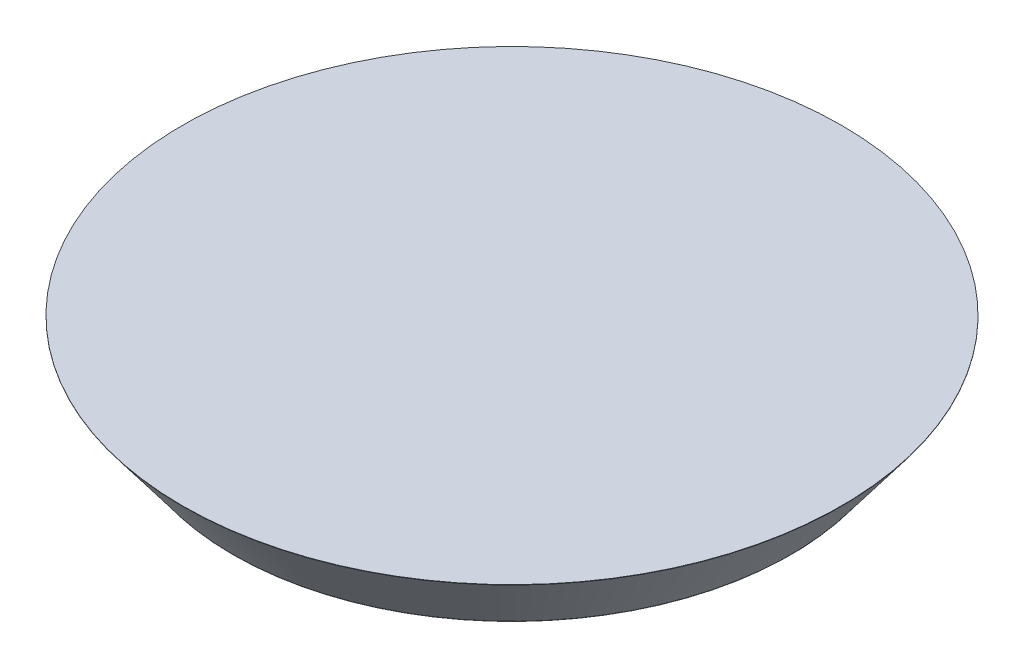
ISO-10303-21;
HEADER;
FILE_DESCRIPTION(('STEP AP214'),'2;1');
FILE_NAME('part.step','',(''),(''),'','','');
FILE_SCHEMA(('AUTOMOTIVE_DESIGN { 1 0 10303 214 1 1 1 1 }'));
ENDSEC;
DATA;
#1=APPLICATION_CONTEXT('core data for automotive mechanical design processes');
#2=APPLICATION_PROTOCOL_DEFINITION('international standard','automotive_design',2000,#1);
#3=PRODUCT_CONTEXT('',#1,'mechanical');
#4=PRODUCT('Part','Part','',(#3));
#5=PRODUCT_RELATED_PRODUCT_CATEGORY('part','',(#4));
#6=PRODUCT_DEFINITION_FORMATION('','',#4);
#7=PRODUCT_DEFINITION_CONTEXT('part definition',#1,'design');
#8=PRODUCT_DEFINITION('design','',#6,#7);
#9=PRODUCT_DEFINITION_SHAPE('','',#8);
#10=(LENGTH_UNIT() NAMED_UNIT(*) SI_UNIT(.MILLI.,.METRE.));
#11=(NAMED_UNIT(*) PLANE_ANGLE_UNIT() SI_UNIT($,.RADIAN.));
#12=(NAMED_UNIT(*) SI_UNIT($,.STERADIAN.) SOLID_ANGLE_UNIT());
#13=UNCERTAINTY_MEASURE_WITH_UNIT(LENGTH_MEASURE(1.E-05),#10,'distance_accuracy_value','');
#14=(GEOMETRIC_REPRESENTATION_CONTEXT(3) GLOBAL_UNCERTAINTY_ASSIGNED_CONTEXT((#13)) GLOBAL_UNIT_ASSIGNED_CONTEXT((#10,
#11,#12)) REPRESENTATION_CONTEXT('',''));
#15=CARTESIAN_POINT('',(0.,0.,0.));
#16=DIRECTION('',(0.,0.,1.));
#17=DIRECTION('',(1.,0.,0.));
#18=AXIS2_PLACEMENT_3D('',#15,#16,#17);
#19=CARTESIAN_POINT('',(0.,6.5024,0.));
#20=DIRECTION('',(0.,-1.,0.));
#21=DIRECTION('',(0.,0.,-1.));
#22=AXIS2_PLACEMENT_3D('',#19,#20,#21);
#23=CYLINDRICAL_SURFACE('',#22,48.8061);
#24=CARTESIAN_POINT('',(0.,3.45125892994247,0.));
#25=DIRECTION('',(0.,1.,0.));
#26=DIRECTION('',(0.,0.,1.));
#27=AXIS2_PLACEMENT_3D('',#24,#25,#26);
#28=CIRCLE('',#27,48.8061);
#29=CARTESIAN_POINT('',(0.,3.45125892994247,48.8061));
#30=VERTEX_POINT('',#29);
#31=EDGE_CURVE('E45',#30,#30,#28,.T.);
#32=ORIENTED_EDGE('',*,*,#31,.T.);
#33=EDGE_LOOP('',(#32));
#34=FACE_BOUND('',#33,.T.);
#35=CARTESIAN_POINT('',(0.,3.50519999999999,0.));
#36=DIRECTION('',(0.,-1.,0.));
#37=DIRECTION('',(0.,0.,-1.));
#38=AXIS2_PLACEMENT_3D('',#35,#36,#37);
#39=CIRCLE('',#38,48.8061);
#40=CARTESIAN_POINT('',(0.,3.5052,-48.8061));
#41=VERTEX_POINT('',#40);
#42=EDGE_CURVE('E11',#41,#41,#39,.T.);
#43=ORIENTED_EDGE('',*,*,#42,.T.);
#44=EDGE_LOOP('',(#43));
#45=FACE_BOUND('',#44,.T.);
#46=ADVANCED_FACE('F34',(#34,#45),#23,.T.);
#47=CARTESIAN_POINT('',(0.,3.45125892994247,0.));
#48=DIRECTION('',(0.,1.,0.));
#49=DIRECTION('',(0.,0.,1.));
#50=AXIS2_PLACEMENT_3D('',#47,#48,#49);
#51=CONICAL_SURFACE('',#50,48.8061,0.645771823237903);
#52=CARTESIAN_POINT('',(0.,-6.5024,0.));
#53=DIRECTION('',(0.,1.,0.));
#54=DIRECTION('',(0.,0.,1.));
#55=AXIS2_PLACEMENT_3D('',#52,#53,#54);
#56=CIRCLE('',#55,41.30548);
#57=CARTESIAN_POINT('',(0.,-6.5024,41.30548));
#58=VERTEX_POINT('',#57);
#59=EDGE_CURVE('E41',#58,#58,#56,.F.);
#60=ORIENTED_EDGE('',*,*,#59,.F.);
#61=EDGE_LOOP('',(#60));
#62=FACE_BOUND('',#61,.T.);
#63=ORIENTED_EDGE('',*,*,#31,.F.);
#64=EDGE_LOOP('',(#63));
#65=FACE_BOUND('',#64,.T.);
#66=ADVANCED_FACE('F36',(#62,#65),#51,.T.);
#67=CARTESIAN_POINT('',(0.,-6.5278,0.));
#68=DIRECTION('',(0.,-1.,0.));
#69=DIRECTION('',(0.,0.,-1.));
#70=AXIS2_PLACEMENT_3D('',#67,#68,#69);
#71=PLANE('',#70);
#72=CARTESIAN_POINT('',(0.,-6.5278,0.));
#73=DIRECTION('',(0.,-1.,0.));
#74=DIRECTION('',(0.,0.,-1.));
#75=AXIS2_PLACEMENT_3D('',#72,#73,#74);
#76=CIRCLE('',#75,41.30548);
#77=CARTESIAN_POINT('',(0.,-6.5278,-41.30548));
#78=VERTEX_POINT('',#77);
#79=EDGE_CURVE('E49',#78,#78,#76,.T.);
#80=ORIENTED_EDGE('',*,*,#79,.T.);
#81=EDGE_LOOP('',(#80));
#82=FACE_BOUND('',#81,.T.);
#83=CARTESIAN_POINT('',(0.,-6.5278,0.));
#84=DIRECTION('',(0.,-1.,0.));
#85=DIRECTION('',(1.,0.,0.));
#86=AXIS2_PLACEMENT_3D('',#83,#84,#85);
#87=CIRCLE('',#86,40.79748);
#88=CARTESIAN_POINT('',(40.79748,-6.5278,0.));
#89=VERTEX_POINT('',#88);
#90=EDGE_CURVE('E54',#89,#89,#87,.T.);
#91=ORIENTED_EDGE('',*,*,#90,.F.);
#92=EDGE_LOOP('',(#91));
#93=FACE_BOUND('',#92,.T.);
#94=ADVANCED_FACE('F64',(#82,#93),#71,.T.);
#95=CARTESIAN_POINT('',(0.,-6.5278,0.));
#96=DIRECTION('',(0.,1.,0.));
#97=DIRECTION('',(0.,0.,1.));
#98=AXIS2_PLACEMENT_3D('',#95,#96,#97);
#99=CYLINDRICAL_SURFACE('',#98,41.30548);
#100=ORIENTED_EDGE('',*,*,#79,.F.);
#101=EDGE_LOOP('',(#100));
#102=FACE_BOUND('',#101,.T.);
#103=ORIENTED_EDGE('',*,*,#59,.T.);
#104=EDGE_LOOP('',(#103));
#105=FACE_BOUND('',#104,.T.);
#106=ADVANCED_FACE('F66',(#102,#105),#99,.T.);
#107=CARTESIAN_POINT('',(0.,-6.5278,0.));
#108=DIRECTION('',(0.,1.,0.));
#109=DIRECTION('',(0.,0.,1.));
#110=AXIS2_PLACEMENT_3D('',#107,#108,#109);
#111=CYLINDRICAL_SURFACE('',#110,40.79748);
#112=ORIENTED_EDGE('',*,*,#90,.T.);
#113=EDGE_LOOP('',(#112));
#114=FACE_BOUND('',#113,.T.);
#115=CARTESIAN_POINT('',(0.,-6.5024,0.));
#116=DIRECTION('',(0.,-1.,0.));
#117=DIRECTION('',(1.,0.,0.));
#118=AXIS2_PLACEMENT_3D('',#115,#116,#117);
#119=CIRCLE('',#118,40.79748);
#120=CARTESIAN_POINT('',(40.79748,-6.5024,0.));
#121=VERTEX_POINT('',#120);
#122=EDGE_CURVE('E55',#121,#121,#119,.T.);
#123=ORIENTED_EDGE('',*,*,#122,.F.);
#124=EDGE_LOOP('',(#123));
#125=FACE_BOUND('',#124,.T.);
#126=ADVANCED_FACE('F61',(#114,#125),#111,.F.);
#127=CARTESIAN_POINT('',(0.,-6.5024,0.));
#128=DIRECTION('',(0.,1.,0.));
#129=DIRECTION('',(0.,0.,1.));
#130=AXIS2_PLACEMENT_3D('',#127,#128,#129);
#131=PLANE('',#130);
#132=ORIENTED_EDGE('',*,*,#122,.T.);
#133=EDGE_LOOP('',(#132));
#134=FACE_BOUND('',#133,.T.);
#135=ADVANCED_FACE('F82',(#134),#131,.F.);
#136=CARTESIAN_POINT('',(-48.8061,3.5052,-48.8061));
#137=DIRECTION('',(0.,-1.,0.));
#138=DIRECTION('',(0.,0.,-1.));
#139=AXIS2_PLACEMENT_3D('',#136,#137,#138);
#140=PLANE('',#139);
#141=ORIENTED_EDGE('',*,*,#42,.F.);
#142=EDGE_LOOP('',(#141));
#143=FACE_BOUND('',#142,.T.);
#144=ADVANCED_FACE('F84',(#143),#140,.F.);
#145=CLOSED_SHELL('',(#46,#66,#94,#106,#126,#135,#144));
#146=MANIFOLD_SOLID_BREP('B2',#145);
#147=ADVANCED_BREP_SHAPE_REPRESENTATION('',(#18,#146),#14);
#148=SHAPE_DEFINITION_REPRESENTATION(#9,#147);
ENDSEC;
END-ISO-10303-21;
